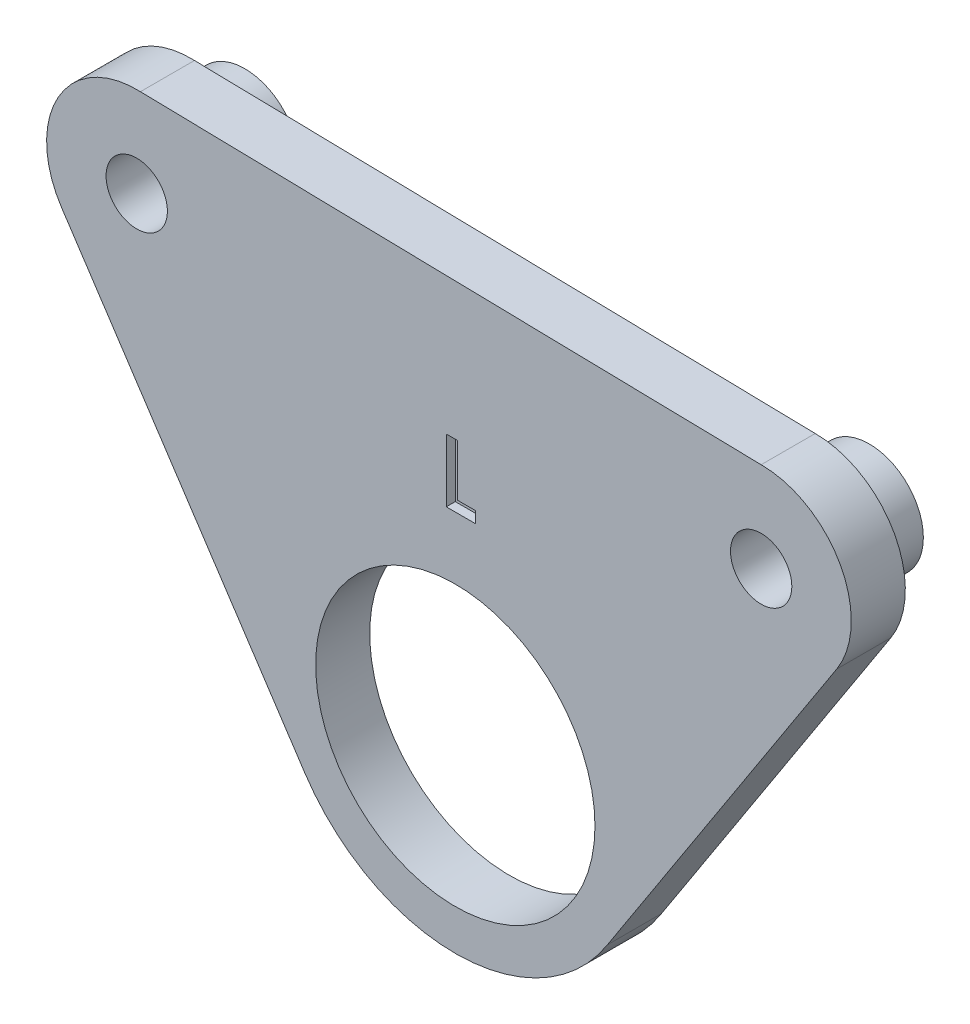
ISO-10303-21;
HEADER;
FILE_DESCRIPTION(('STEP AP214'),'2;1');
FILE_NAME('part.step','',(''),(''),'','','');
FILE_SCHEMA(('AUTOMOTIVE_DESIGN { 1 0 10303 214 1 1 1 1 }'));
ENDSEC;
DATA;
#1=APPLICATION_CONTEXT('core data for automotive mechanical design processes');
#2=APPLICATION_PROTOCOL_DEFINITION('international standard','automotive_design',2000,#1);
#3=PRODUCT_CONTEXT('',#1,'mechanical');
#4=PRODUCT('Part','Part','',(#3));
#5=PRODUCT_RELATED_PRODUCT_CATEGORY('part','',(#4));
#6=PRODUCT_DEFINITION_FORMATION('','',#4);
#7=PRODUCT_DEFINITION_CONTEXT('part definition',#1,'design');
#8=PRODUCT_DEFINITION('design','',#6,#7);
#9=PRODUCT_DEFINITION_SHAPE('','',#8);
#10=(LENGTH_UNIT() NAMED_UNIT(*) SI_UNIT(.MILLI.,.METRE.));
#11=(NAMED_UNIT(*) PLANE_ANGLE_UNIT() SI_UNIT($,.RADIAN.));
#12=(NAMED_UNIT(*) SI_UNIT($,.STERADIAN.) SOLID_ANGLE_UNIT());
#13=UNCERTAINTY_MEASURE_WITH_UNIT(LENGTH_MEASURE(1.E-05),#10,'distance_accuracy_value','');
#14=(GEOMETRIC_REPRESENTATION_CONTEXT(3) GLOBAL_UNCERTAINTY_ASSIGNED_CONTEXT((#13)) GLOBAL_UNIT_ASSIGNED_CONTEXT((#10,
#11,#12)) REPRESENTATION_CONTEXT('',''));
#15=CARTESIAN_POINT('',(0.,0.,0.));
#16=DIRECTION('',(0.,0.,1.));
#17=DIRECTION('',(1.,0.,0.));
#18=AXIS2_PLACEMENT_3D('',#15,#16,#17);
#19=CARTESIAN_POINT('',(0.,0.,3.));
#20=DIRECTION('',(0.,0.,1.));
#21=DIRECTION('',(1.,0.,0.));
#22=AXIS2_PLACEMENT_3D('',#19,#20,#21);
#23=PLANE('',#22);
#24=CARTESIAN_POINT('',(0.,0.,3.));
#25=DIRECTION('',(0.,0.,1.));
#26=DIRECTION('',(1.,0.,0.));
#27=AXIS2_PLACEMENT_3D('',#24,#25,#26);
#28=CIRCLE('',#27,7.75);
#29=CARTESIAN_POINT('',(7.75,0.,3.));
#30=VERTEX_POINT('',#29);
#31=EDGE_CURVE('E166',#30,#30,#28,.T.);
#32=ORIENTED_EDGE('',*,*,#31,.F.);
#33=EDGE_LOOP('',(#32));
#34=FACE_BOUND('',#33,.T.);
#35=DIRECTION('',(0.544290350783023,0.838896903108179,0.));
#36=VECTOR('',#35,1.);
#37=CARTESIAN_POINT('',(8.38866617449037,-5.44270700940501,3.));
#38=LINE('',#37,#36);
#39=CARTESIAN_POINT('',(8.4349155563697,-5.37142435085076,3.));
#40=VERTEX_POINT('',#39);
#41=CARTESIAN_POINT('',(21.165047264018,14.249110994562,3.));
#42=VERTEX_POINT('',#41);
#43=EDGE_CURVE('E184',#40,#42,#38,.T.);
#44=ORIENTED_EDGE('',*,*,#43,.T.);
#45=CARTESIAN_POINT('',(16.9705627484771,16.9705627484772,3.));
#46=DIRECTION('',(0.,0.,1.));
#47=DIRECTION('',(1.,0.,0.));
#48=AXIS2_PLACEMENT_3D('',#45,#46,#47);
#49=CIRCLE('',#48,5.00000000000006);
#50=CARTESIAN_POINT('',(16.9705627484771,21.9705627484772,3.));
#51=VERTEX_POINT('',#50);
#52=EDGE_CURVE('E101',#42,#51,#49,.T.);
#53=ORIENTED_EDGE('',*,*,#52,.T.);
#54=DIRECTION('',(0.999791818463447,-0.0204039146625116,0.));
#55=VECTOR('',#54,1.);
#56=CARTESIAN_POINT('',(0.455257342807428,22.3076097975724,3.));
#57=LINE('',#56,#55);
#58=CARTESIAN_POINT('',(-17.4736728602218,22.673506332328,3.));
#59=VERTEX_POINT('',#58);
#60=EDGE_CURVE('E119',#59,#51,#57,.T.);
#61=ORIENTED_EDGE('',*,*,#60,.F.);
#62=CARTESIAN_POINT('',(-17.6776695296638,17.6776695296636,3.));
#63=DIRECTION('',(0.,0.,1.));
#64=DIRECTION('',(1.,0.,0.));
#65=AXIS2_PLACEMENT_3D('',#62,#63,#64);
#66=CIRCLE('',#65,4.99999999999995);
#67=CARTESIAN_POINT('',(-21.8488779259881,14.9206746957124,3.));
#68=VERTEX_POINT('',#67);
#69=EDGE_CURVE('E112',#59,#68,#66,.T.);
#70=ORIENTED_EDGE('',*,*,#69,.T.);
#71=DIRECTION('',(0.551398966790246,-0.834241679264857,0.));
#72=VECTOR('',#71,1.);
#73=CARTESIAN_POINT('',(-8.34241679264857,-5.51398966790246,3.));
#74=LINE('',#73,#72);
#75=CARTESIAN_POINT('',(-8.34241679264857,-5.51398966790246,3.));
#76=VERTEX_POINT('',#75);
#77=EDGE_CURVE('E116',#68,#76,#74,.T.);
#78=ORIENTED_EDGE('',*,*,#77,.T.);
#79=CARTESIAN_POINT('',(0.,0.,3.));
#80=DIRECTION('',(0.,0.,1.));
#81=DIRECTION('',(1.,0.,0.));
#82=AXIS2_PLACEMENT_3D('',#79,#80,#81);
#83=CIRCLE('',#82,10.);
#84=EDGE_CURVE('E66',#76,#40,#83,.T.);
#85=ORIENTED_EDGE('',*,*,#84,.T.);
#86=EDGE_LOOP('',(#44,#53,#61,#70,#78,#85));
#87=FACE_BOUND('',#86,.T.);
#88=CARTESIAN_POINT('',(-17.6776695296638,17.6776695296636,3.));
#89=DIRECTION('',(0.,0.,1.));
#90=DIRECTION('',(1.,0.,0.));
#91=AXIS2_PLACEMENT_3D('',#88,#89,#90);
#92=CIRCLE('',#91,1.7025);
#93=CARTESIAN_POINT('',(-15.9751695296638,17.6776695296636,3.));
#94=VERTEX_POINT('',#93);
#95=EDGE_CURVE('E203',#94,#94,#92,.T.);
#96=ORIENTED_EDGE('',*,*,#95,.F.);
#97=EDGE_LOOP('',(#96));
#98=FACE_BOUND('',#97,.T.);
#99=CARTESIAN_POINT('',(16.9705627484771,16.9705627484772,3.));
#100=DIRECTION('',(0.,0.,1.));
#101=DIRECTION('',(1.,0.,0.));
#102=AXIS2_PLACEMENT_3D('',#99,#100,#101);
#103=CIRCLE('',#102,1.7025);
#104=CARTESIAN_POINT('',(18.6730627484771,16.9705627484772,3.));
#105=VERTEX_POINT('',#104);
#106=EDGE_CURVE('E219',#105,#105,#103,.T.);
#107=ORIENTED_EDGE('',*,*,#106,.F.);
#108=EDGE_LOOP('',(#107));
#109=FACE_BOUND('',#108,.T.);
#110=DIRECTION('',(-1.,0.,0.));
#111=VECTOR('',#110,1.);
#112=CARTESIAN_POINT('',(1.11433669953368,11.2108490749523,3.));
#113=LINE('',#112,#111);
#114=CARTESIAN_POINT('',(1.11433669953368,11.2108490749523,3.));
#115=VERTEX_POINT('',#114);
#116=CARTESIAN_POINT('',(-0.501047915850938,11.2108490749523,3.));
#117=VERTEX_POINT('',#116);
#118=EDGE_CURVE('E249',#115,#117,#113,.T.);
#119=ORIENTED_EDGE('',*,*,#118,.T.);
#120=DIRECTION('',(0.,1.,0.));
#121=VECTOR('',#120,1.);
#122=CARTESIAN_POINT('',(-0.501047915850938,11.2108490749523,3.));
#123=LINE('',#122,#121);
#124=CARTESIAN_POINT('',(-0.501047915850938,14.7108490749523,3.));
#125=VERTEX_POINT('',#124);
#126=EDGE_CURVE('E57',#117,#125,#123,.T.);
#127=ORIENTED_EDGE('',*,*,#126,.T.);
#128=DIRECTION('',(1.,0.,0.));
#129=VECTOR('',#128,1.);
#130=CARTESIAN_POINT('',(-0.501047915850938,14.7108490749523,3.));
#131=LINE('',#130,#129);
#132=CARTESIAN_POINT('',(0.12715721235419,14.7108490749523,3.));
#133=VERTEX_POINT('',#132);
#134=EDGE_CURVE('E266',#125,#133,#131,.T.);
#135=ORIENTED_EDGE('',*,*,#134,.T.);
#136=DIRECTION('',(0.,-1.,0.));
#137=VECTOR('',#136,1.);
#138=CARTESIAN_POINT('',(0.12715721235419,14.7108490749523,3.));
#139=LINE('',#138,#137);
#140=CARTESIAN_POINT('',(0.12715721235419,11.8390542031574,3.));
#141=VERTEX_POINT('',#140);
#142=EDGE_CURVE('E262',#133,#141,#139,.T.);
#143=ORIENTED_EDGE('',*,*,#142,.T.);
#144=DIRECTION('',(1.,0.,0.));
#145=VECTOR('',#144,1.);
#146=CARTESIAN_POINT('',(0.12715721235419,11.8390542031574,3.));
#147=LINE('',#146,#145);
#148=CARTESIAN_POINT('',(1.11433669953368,11.8390542031574,3.));
#149=VERTEX_POINT('',#148);
#150=EDGE_CURVE('E258',#141,#149,#147,.T.);
#151=ORIENTED_EDGE('',*,*,#150,.T.);
#152=DIRECTION('',(0.,-1.,0.));
#153=VECTOR('',#152,1.);
#154=CARTESIAN_POINT('',(1.11433669953368,11.8390542031574,3.));
#155=LINE('',#154,#153);
#156=EDGE_CURVE('E254',#149,#115,#155,.T.);
#157=ORIENTED_EDGE('',*,*,#156,.T.);
#158=EDGE_LOOP('',(#119,#127,#135,#143,#151,#157));
#159=FACE_BOUND('',#158,.T.);
#160=ADVANCED_FACE('F41',(#34,#87,#98,#109,#159),#23,.T.);
#161=CARTESIAN_POINT('',(8.38866617449037,-5.44270700940501,3.));
#162=DIRECTION('',(-0.838896903108179,0.544290350783023,0.));
#163=DIRECTION('',(-0.544290350783023,-0.838896903108179,0.));
#164=AXIS2_PLACEMENT_3D('',#161,#162,#163);
#165=PLANE('',#164);
#166=DIRECTION('',(0.544290350783023,0.838896903108179,0.));
#167=VECTOR('',#166,1.);
#168=CARTESIAN_POINT('',(8.38866617449037,-5.44270700940501,0.));
#169=LINE('',#168,#167);
#170=CARTESIAN_POINT('',(8.4349155563697,-5.37142435085076,0.));
#171=VERTEX_POINT('',#170);
#172=CARTESIAN_POINT('',(21.165047264018,14.249110994562,0.));
#173=VERTEX_POINT('',#172);
#174=EDGE_CURVE('E146',#171,#173,#169,.T.);
#175=ORIENTED_EDGE('',*,*,#174,.T.);
#176=DIRECTION('',(0.,0.,-1.));
#177=VECTOR('',#176,1.);
#178=CARTESIAN_POINT('',(21.165047264018,14.249110994562,3.));
#179=LINE('',#178,#177);
#180=EDGE_CURVE('E11',#42,#173,#179,.T.);
#181=ORIENTED_EDGE('',*,*,#180,.F.);
#182=ORIENTED_EDGE('',*,*,#43,.F.);
#183=DIRECTION('',(0.,0.,-1.));
#184=VECTOR('',#183,1.);
#185=CARTESIAN_POINT('',(8.4349155563697,-5.37142435085076,3.));
#186=LINE('',#185,#184);
#187=EDGE_CURVE('E138',#40,#171,#186,.T.);
#188=ORIENTED_EDGE('',*,*,#187,.T.);
#189=EDGE_LOOP('',(#175,#181,#182,#188));
#190=FACE_BOUND('',#189,.T.);
#191=ADVANCED_FACE('F185',(#190),#165,.F.);
#192=CARTESIAN_POINT('',(16.9705627484771,16.9705627484772,3.));
#193=DIRECTION('',(0.,0.,-1.));
#194=DIRECTION('',(-1.,0.,0.));
#195=AXIS2_PLACEMENT_3D('',#192,#193,#194);
#196=CYLINDRICAL_SURFACE('',#195,5.00000000000006);
#197=CARTESIAN_POINT('',(16.9705627484771,16.9705627484772,0.));
#198=DIRECTION('',(0.,0.,1.));
#199=DIRECTION('',(1.,0.,0.));
#200=AXIS2_PLACEMENT_3D('',#197,#198,#199);
#201=CIRCLE('',#200,5.00000000000006);
#202=CARTESIAN_POINT('',(16.9705627484771,21.9705627484772,0.));
#203=VERTEX_POINT('',#202);
#204=EDGE_CURVE('E151',#173,#203,#201,.T.);
#205=ORIENTED_EDGE('',*,*,#204,.T.);
#206=DIRECTION('',(0.,0.,-1.));
#207=VECTOR('',#206,1.);
#208=CARTESIAN_POINT('',(16.9705627484771,21.9705627484772,3.));
#209=LINE('',#208,#207);
#210=EDGE_CURVE('E50',#51,#203,#209,.T.);
#211=ORIENTED_EDGE('',*,*,#210,.F.);
#212=ORIENTED_EDGE('',*,*,#52,.F.);
#213=ORIENTED_EDGE('',*,*,#180,.T.);
#214=EDGE_LOOP('',(#205,#211,#212,#213));
#215=FACE_BOUND('',#214,.T.);
#216=ADVANCED_FACE('F176',(#215),#196,.T.);
#217=CARTESIAN_POINT('',(0.455257342807428,22.3076097975724,3.));
#218=DIRECTION('',(0.0204039146625116,0.999791818463446,0.));
#219=DIRECTION('',(-0.999791818463446,0.0204039146625116,0.));
#220=AXIS2_PLACEMENT_3D('',#217,#218,#219);
#221=PLANE('',#220);
#222=DIRECTION('',(0.999791818463447,-0.0204039146625116,0.));
#223=VECTOR('',#222,1.);
#224=CARTESIAN_POINT('',(0.455257342807428,22.3076097975724,0.));
#225=LINE('',#224,#223);
#226=CARTESIAN_POINT('',(-17.4736728602218,22.673506332328,0.));
#227=VERTEX_POINT('',#226);
#228=EDGE_CURVE('E155',#227,#203,#225,.T.);
#229=ORIENTED_EDGE('',*,*,#228,.F.);
#230=DIRECTION('',(0.,0.,-1.));
#231=VECTOR('',#230,1.);
#232=CARTESIAN_POINT('',(-17.4736728602218,22.673506332328,3.));
#233=LINE('',#232,#231);
#234=EDGE_CURVE('E131',#59,#227,#233,.T.);
#235=ORIENTED_EDGE('',*,*,#234,.F.);
#236=ORIENTED_EDGE('',*,*,#60,.T.);
#237=ORIENTED_EDGE('',*,*,#210,.T.);
#238=EDGE_LOOP('',(#229,#235,#236,#237));
#239=FACE_BOUND('',#238,.T.);
#240=ADVANCED_FACE('F175',(#239),#221,.T.);
#241=CARTESIAN_POINT('',(-17.6776695296638,17.6776695296636,3.));
#242=DIRECTION('',(0.,0.,-1.));
#243=DIRECTION('',(-1.,0.,0.));
#244=AXIS2_PLACEMENT_3D('',#241,#242,#243);
#245=CYLINDRICAL_SURFACE('',#244,4.99999999999995);
#246=CARTESIAN_POINT('',(-17.6776695296638,17.6776695296636,0.));
#247=DIRECTION('',(0.,0.,1.));
#248=DIRECTION('',(1.,0.,0.));
#249=AXIS2_PLACEMENT_3D('',#246,#247,#248);
#250=CIRCLE('',#249,4.99999999999995);
#251=CARTESIAN_POINT('',(-21.8488779259881,14.9206746957124,0.));
#252=VERTEX_POINT('',#251);
#253=EDGE_CURVE('E127',#227,#252,#250,.T.);
#254=ORIENTED_EDGE('',*,*,#253,.T.);
#255=DIRECTION('',(0.,0.,-1.));
#256=VECTOR('',#255,1.);
#257=CARTESIAN_POINT('',(-21.8488779259881,14.9206746957124,3.));
#258=LINE('',#257,#256);
#259=EDGE_CURVE('E124',#68,#252,#258,.T.);
#260=ORIENTED_EDGE('',*,*,#259,.F.);
#261=ORIENTED_EDGE('',*,*,#69,.F.);
#262=ORIENTED_EDGE('',*,*,#234,.T.);
#263=EDGE_LOOP('',(#254,#260,#261,#262));
#264=FACE_BOUND('',#263,.T.);
#265=ADVANCED_FACE('F125',(#264),#245,.T.);
#266=CARTESIAN_POINT('',(-8.34241679264857,-5.51398966790246,3.));
#267=DIRECTION('',(0.834241679264857,0.551398966790246,0.));
#268=DIRECTION('',(-0.551398966790246,0.834241679264857,0.));
#269=AXIS2_PLACEMENT_3D('',#266,#267,#268);
#270=PLANE('',#269);
#271=DIRECTION('',(0.551398966790246,-0.834241679264857,0.));
#272=VECTOR('',#271,1.);
#273=CARTESIAN_POINT('',(-8.34241679264857,-5.51398966790246,0.));
#274=LINE('',#273,#272);
#275=CARTESIAN_POINT('',(-8.34241679264857,-5.51398966790246,0.));
#276=VERTEX_POINT('',#275);
#277=EDGE_CURVE('E161',#252,#276,#274,.T.);
#278=ORIENTED_EDGE('',*,*,#277,.T.);
#279=DIRECTION('',(0.,0.,-1.));
#280=VECTOR('',#279,1.);
#281=CARTESIAN_POINT('',(-8.34241679264857,-5.51398966790246,3.));
#282=LINE('',#281,#280);
#283=EDGE_CURVE('E132',#76,#276,#282,.T.);
#284=ORIENTED_EDGE('',*,*,#283,.F.);
#285=ORIENTED_EDGE('',*,*,#77,.F.);
#286=ORIENTED_EDGE('',*,*,#259,.T.);
#287=EDGE_LOOP('',(#278,#284,#285,#286));
#288=FACE_BOUND('',#287,.T.);
#289=ADVANCED_FACE('F134',(#288),#270,.F.);
#290=CARTESIAN_POINT('',(0.,0.,3.));
#291=DIRECTION('',(0.,0.,-1.));
#292=DIRECTION('',(-1.,0.,0.));
#293=AXIS2_PLACEMENT_3D('',#290,#291,#292);
#294=CYLINDRICAL_SURFACE('',#293,7.75);
#295=ORIENTED_EDGE('',*,*,#31,.T.);
#296=EDGE_LOOP('',(#295));
#297=FACE_BOUND('',#296,.T.);
#298=CARTESIAN_POINT('',(0.,0.,0.));
#299=DIRECTION('',(0.,0.,1.));
#300=DIRECTION('',(1.,0.,0.));
#301=AXIS2_PLACEMENT_3D('',#298,#299,#300);
#302=CIRCLE('',#301,7.75);
#303=CARTESIAN_POINT('',(7.75,0.,0.));
#304=VERTEX_POINT('',#303);
#305=EDGE_CURVE('E142',#304,#304,#302,.T.);
#306=ORIENTED_EDGE('',*,*,#305,.F.);
#307=EDGE_LOOP('',(#306));
#308=FACE_BOUND('',#307,.T.);
#309=ADVANCED_FACE('F43',(#297,#308),#294,.F.);
#310=CARTESIAN_POINT('',(0.,0.,3.));
#311=DIRECTION('',(0.,0.,-1.));
#312=DIRECTION('',(-1.,0.,0.));
#313=AXIS2_PLACEMENT_3D('',#310,#311,#312);
#314=CYLINDRICAL_SURFACE('',#313,10.);
#315=CARTESIAN_POINT('',(0.,0.,0.));
#316=DIRECTION('',(0.,0.,1.));
#317=DIRECTION('',(1.,0.,0.));
#318=AXIS2_PLACEMENT_3D('',#315,#316,#317);
#319=CIRCLE('',#318,10.);
#320=EDGE_CURVE('E93',#276,#171,#319,.T.);
#321=ORIENTED_EDGE('',*,*,#320,.T.);
#322=ORIENTED_EDGE('',*,*,#187,.F.);
#323=ORIENTED_EDGE('',*,*,#84,.F.);
#324=ORIENTED_EDGE('',*,*,#283,.T.);
#325=EDGE_LOOP('',(#321,#322,#323,#324));
#326=FACE_BOUND('',#325,.T.);
#327=ADVANCED_FACE('F181',(#326),#314,.T.);
#328=CARTESIAN_POINT('',(0.,0.,0.));
#329=DIRECTION('',(0.,0.,1.));
#330=DIRECTION('',(1.,0.,0.));
#331=AXIS2_PLACEMENT_3D('',#328,#329,#330);
#332=PLANE('',#331);
#333=ORIENTED_EDGE('',*,*,#305,.T.);
#334=EDGE_LOOP('',(#333));
#335=FACE_BOUND('',#334,.T.);
#336=CARTESIAN_POINT('',(-17.6776695296638,17.6776695296636,0.));
#337=DIRECTION('',(0.,0.,1.));
#338=DIRECTION('',(1.,0.,0.));
#339=AXIS2_PLACEMENT_3D('',#336,#337,#338);
#340=CIRCLE('',#339,3.00000000000012);
#341=CARTESIAN_POINT('',(-14.6776695296637,17.6776695296636,0.));
#342=VERTEX_POINT('',#341);
#343=EDGE_CURVE('E147',#342,#342,#340,.T.);
#344=ORIENTED_EDGE('',*,*,#343,.T.);
#345=EDGE_LOOP('',(#344));
#346=FACE_BOUND('',#345,.T.);
#347=CARTESIAN_POINT('',(16.9705627484771,16.9705627484772,0.));
#348=DIRECTION('',(0.,0.,1.));
#349=DIRECTION('',(1.,0.,0.));
#350=AXIS2_PLACEMENT_3D('',#347,#348,#349);
#351=CIRCLE('',#350,3.00000000000005);
#352=CARTESIAN_POINT('',(19.9705627484771,16.9705627484772,0.));
#353=VERTEX_POINT('',#352);
#354=EDGE_CURVE('E207',#353,#353,#351,.T.);
#355=ORIENTED_EDGE('',*,*,#354,.T.);
#356=EDGE_LOOP('',(#355));
#357=FACE_BOUND('',#356,.T.);
#358=ORIENTED_EDGE('',*,*,#174,.F.);
#359=ORIENTED_EDGE('',*,*,#320,.F.);
#360=ORIENTED_EDGE('',*,*,#277,.F.);
#361=ORIENTED_EDGE('',*,*,#253,.F.);
#362=ORIENTED_EDGE('',*,*,#228,.T.);
#363=ORIENTED_EDGE('',*,*,#204,.F.);
#364=EDGE_LOOP('',(#358,#359,#360,#361,#362,#363));
#365=FACE_BOUND('',#364,.T.);
#366=ADVANCED_FACE('F180',(#335,#346,#357,#365),#332,.F.);
#367=CARTESIAN_POINT('',(-17.6776695296638,17.6776695296636,-3.));
#368=DIRECTION('',(0.,0.,1.));
#369=DIRECTION('',(1.,0.,0.));
#370=AXIS2_PLACEMENT_3D('',#367,#368,#369);
#371=CYLINDRICAL_SURFACE('',#370,3.00000000000012);
#372=CARTESIAN_POINT('',(-17.6776695296638,17.6776695296636,-3.));
#373=DIRECTION('',(0.,0.,1.));
#374=DIRECTION('',(1.,0.,0.));
#375=AXIS2_PLACEMENT_3D('',#372,#373,#374);
#376=CIRCLE('',#375,3.00000000000012);
#377=CARTESIAN_POINT('',(-14.6776695296637,17.6776695296636,-3.));
#378=VERTEX_POINT('',#377);
#379=EDGE_CURVE('E198',#378,#378,#376,.T.);
#380=ORIENTED_EDGE('',*,*,#379,.T.);
#381=EDGE_LOOP('',(#380));
#382=FACE_BOUND('',#381,.T.);
#383=ORIENTED_EDGE('',*,*,#343,.F.);
#384=EDGE_LOOP('',(#383));
#385=FACE_BOUND('',#384,.T.);
#386=ADVANCED_FACE('F358',(#382,#385),#371,.T.);
#387=CARTESIAN_POINT('',(-17.6776695296638,17.6776695296636,-3.));
#388=DIRECTION('',(0.,0.,1.));
#389=DIRECTION('',(1.,0.,0.));
#390=AXIS2_PLACEMENT_3D('',#387,#388,#389);
#391=PLANE('',#390);
#392=CARTESIAN_POINT('',(-17.6776695296638,17.6776695296636,-3.));
#393=DIRECTION('',(0.,0.,1.));
#394=DIRECTION('',(1.,0.,0.));
#395=AXIS2_PLACEMENT_3D('',#392,#393,#394);
#396=CIRCLE('',#395,1.7025);
#397=CARTESIAN_POINT('',(-15.9751695296638,17.6776695296636,-3.));
#398=VERTEX_POINT('',#397);
#399=EDGE_CURVE('E202',#398,#398,#396,.T.);
#400=ORIENTED_EDGE('',*,*,#399,.T.);
#401=EDGE_LOOP('',(#400));
#402=FACE_BOUND('',#401,.T.);
#403=ORIENTED_EDGE('',*,*,#379,.F.);
#404=EDGE_LOOP('',(#403));
#405=FACE_BOUND('',#404,.T.);
#406=ADVANCED_FACE('F408',(#402,#405),#391,.F.);
#407=CARTESIAN_POINT('',(-17.6776695296638,17.6776695296636,-3.));
#408=DIRECTION('',(0.,0.,1.));
#409=DIRECTION('',(1.,0.,0.));
#410=AXIS2_PLACEMENT_3D('',#407,#408,#409);
#411=CYLINDRICAL_SURFACE('',#410,1.7025);
#412=ORIENTED_EDGE('',*,*,#399,.F.);
#413=EDGE_LOOP('',(#412));
#414=FACE_BOUND('',#413,.T.);
#415=ORIENTED_EDGE('',*,*,#95,.T.);
#416=EDGE_LOOP('',(#415));
#417=FACE_BOUND('',#416,.T.);
#418=ADVANCED_FACE('F415',(#414,#417),#411,.F.);
#419=CARTESIAN_POINT('',(16.9705627484771,16.9705627484772,-3.));
#420=DIRECTION('',(0.,0.,1.));
#421=DIRECTION('',(1.,0.,0.));
#422=AXIS2_PLACEMENT_3D('',#419,#420,#421);
#423=CYLINDRICAL_SURFACE('',#422,3.00000000000005);
#424=CARTESIAN_POINT('',(16.9705627484771,16.9705627484772,-3.));
#425=DIRECTION('',(0.,0.,1.));
#426=DIRECTION('',(1.,0.,0.));
#427=AXIS2_PLACEMENT_3D('',#424,#425,#426);
#428=CIRCLE('',#427,3.00000000000005);
#429=CARTESIAN_POINT('',(19.9705627484771,16.9705627484772,-3.));
#430=VERTEX_POINT('',#429);
#431=EDGE_CURVE('E214',#430,#430,#428,.T.);
#432=ORIENTED_EDGE('',*,*,#431,.T.);
#433=EDGE_LOOP('',(#432));
#434=FACE_BOUND('',#433,.T.);
#435=ORIENTED_EDGE('',*,*,#354,.F.);
#436=EDGE_LOOP('',(#435));
#437=FACE_BOUND('',#436,.T.);
#438=ADVANCED_FACE('F422',(#434,#437),#423,.T.);
#439=CARTESIAN_POINT('',(16.9705627484771,16.9705627484772,-3.));
#440=DIRECTION('',(0.,0.,1.));
#441=DIRECTION('',(1.,0.,0.));
#442=AXIS2_PLACEMENT_3D('',#439,#440,#441);
#443=PLANE('',#442);
#444=CARTESIAN_POINT('',(16.9705627484771,16.9705627484772,-3.));
#445=DIRECTION('',(0.,0.,1.));
#446=DIRECTION('',(1.,0.,0.));
#447=AXIS2_PLACEMENT_3D('',#444,#445,#446);
#448=CIRCLE('',#447,1.7025);
#449=CARTESIAN_POINT('',(18.6730627484771,16.9705627484772,-3.));
#450=VERTEX_POINT('',#449);
#451=EDGE_CURVE('E218',#450,#450,#448,.T.);
#452=ORIENTED_EDGE('',*,*,#451,.T.);
#453=EDGE_LOOP('',(#452));
#454=FACE_BOUND('',#453,.T.);
#455=ORIENTED_EDGE('',*,*,#431,.F.);
#456=EDGE_LOOP('',(#455));
#457=FACE_BOUND('',#456,.T.);
#458=ADVANCED_FACE('F430',(#454,#457),#443,.F.);
#459=CARTESIAN_POINT('',(16.9705627484771,16.9705627484772,-3.));
#460=DIRECTION('',(0.,0.,1.));
#461=DIRECTION('',(1.,0.,0.));
#462=AXIS2_PLACEMENT_3D('',#459,#460,#461);
#463=CYLINDRICAL_SURFACE('',#462,1.7025);
#464=ORIENTED_EDGE('',*,*,#451,.F.);
#465=EDGE_LOOP('',(#464));
#466=FACE_BOUND('',#465,.T.);
#467=ORIENTED_EDGE('',*,*,#106,.T.);
#468=EDGE_LOOP('',(#467));
#469=FACE_BOUND('',#468,.T.);
#470=ADVANCED_FACE('F438',(#466,#469),#463,.F.);
#471=CARTESIAN_POINT('',(-0.501047915850938,11.2108490749523,2.5));
#472=DIRECTION('',(1.,0.,0.));
#473=DIRECTION('',(0.,0.,-1.));
#474=AXIS2_PLACEMENT_3D('',#471,#472,#473);
#475=PLANE('',#474);
#476=ORIENTED_EDGE('',*,*,#126,.F.);
#477=DIRECTION('',(0.,0.,1.));
#478=VECTOR('',#477,1.);
#479=CARTESIAN_POINT('',(-0.501047915850938,11.2108490749523,2.5));
#480=LINE('',#479,#478);
#481=CARTESIAN_POINT('',(-0.501047915850938,11.2108490749523,2.5));
#482=VERTEX_POINT('',#481);
#483=EDGE_CURVE('E245',#482,#117,#480,.T.);
#484=ORIENTED_EDGE('',*,*,#483,.F.);
#485=DIRECTION('',(0.,1.,0.));
#486=VECTOR('',#485,1.);
#487=CARTESIAN_POINT('',(-0.501047915850938,11.2108490749523,2.5));
#488=LINE('',#487,#486);
#489=CARTESIAN_POINT('',(-0.501047915850938,14.7108490749523,2.5));
#490=VERTEX_POINT('',#489);
#491=EDGE_CURVE('E253',#482,#490,#488,.T.);
#492=ORIENTED_EDGE('',*,*,#491,.T.);
#493=DIRECTION('',(0.,0.,1.));
#494=VECTOR('',#493,1.);
#495=CARTESIAN_POINT('',(-0.501047915850938,14.7108490749523,2.5));
#496=LINE('',#495,#494);
#497=EDGE_CURVE('E223',#490,#125,#496,.T.);
#498=ORIENTED_EDGE('',*,*,#497,.T.);
#499=EDGE_LOOP('',(#476,#484,#492,#498));
#500=FACE_BOUND('',#499,.T.);
#501=ADVANCED_FACE('F296',(#500),#475,.T.);
#502=CARTESIAN_POINT('',(-0.501047915850938,14.7108490749523,2.5));
#503=DIRECTION('',(0.,-1.,0.));
#504=DIRECTION('',(0.,0.,-1.));
#505=AXIS2_PLACEMENT_3D('',#502,#503,#504);
#506=PLANE('',#505);
#507=ORIENTED_EDGE('',*,*,#134,.F.);
#508=ORIENTED_EDGE('',*,*,#497,.F.);
#509=DIRECTION('',(1.,0.,0.));
#510=VECTOR('',#509,1.);
#511=CARTESIAN_POINT('',(-0.501047915850938,14.7108490749523,2.5));
#512=LINE('',#511,#510);
#513=CARTESIAN_POINT('',(0.12715721235419,14.7108490749523,2.5));
#514=VERTEX_POINT('',#513);
#515=EDGE_CURVE('E287',#490,#514,#512,.T.);
#516=ORIENTED_EDGE('',*,*,#515,.T.);
#517=DIRECTION('',(0.,0.,1.));
#518=VECTOR('',#517,1.);
#519=CARTESIAN_POINT('',(0.12715721235419,14.7108490749523,2.5));
#520=LINE('',#519,#518);
#521=EDGE_CURVE('E229',#514,#133,#520,.T.);
#522=ORIENTED_EDGE('',*,*,#521,.T.);
#523=EDGE_LOOP('',(#507,#508,#516,#522));
#524=FACE_BOUND('',#523,.T.);
#525=ADVANCED_FACE('F305',(#524),#506,.T.);
#526=CARTESIAN_POINT('',(0.12715721235419,14.7108490749523,2.5));
#527=DIRECTION('',(-1.,0.,0.));
#528=DIRECTION('',(0.,0.,1.));
#529=AXIS2_PLACEMENT_3D('',#526,#527,#528);
#530=PLANE('',#529);
#531=ORIENTED_EDGE('',*,*,#142,.F.);
#532=ORIENTED_EDGE('',*,*,#521,.F.);
#533=DIRECTION('',(0.,-1.,0.));
#534=VECTOR('',#533,1.);
#535=CARTESIAN_POINT('',(0.12715721235419,14.7108490749523,2.5));
#536=LINE('',#535,#534);
#537=CARTESIAN_POINT('',(0.12715721235419,11.8390542031574,2.5));
#538=VERTEX_POINT('',#537);
#539=EDGE_CURVE('E283',#514,#538,#536,.T.);
#540=ORIENTED_EDGE('',*,*,#539,.T.);
#541=DIRECTION('',(0.,0.,1.));
#542=VECTOR('',#541,1.);
#543=CARTESIAN_POINT('',(0.12715721235419,11.8390542031574,2.5));
#544=LINE('',#543,#542);
#545=EDGE_CURVE('E233',#538,#141,#544,.T.);
#546=ORIENTED_EDGE('',*,*,#545,.T.);
#547=EDGE_LOOP('',(#531,#532,#540,#546));
#548=FACE_BOUND('',#547,.T.);
#549=ADVANCED_FACE('F340',(#548),#530,.T.);
#550=CARTESIAN_POINT('',(0.12715721235419,11.8390542031574,2.5));
#551=DIRECTION('',(0.,-1.,0.));
#552=DIRECTION('',(0.,0.,-1.));
#553=AXIS2_PLACEMENT_3D('',#550,#551,#552);
#554=PLANE('',#553);
#555=ORIENTED_EDGE('',*,*,#150,.F.);
#556=ORIENTED_EDGE('',*,*,#545,.F.);
#557=DIRECTION('',(1.,0.,0.));
#558=VECTOR('',#557,1.);
#559=CARTESIAN_POINT('',(0.12715721235419,11.8390542031574,2.5));
#560=LINE('',#559,#558);
#561=CARTESIAN_POINT('',(1.11433669953368,11.8390542031574,2.5));
#562=VERTEX_POINT('',#561);
#563=EDGE_CURVE('E279',#538,#562,#560,.T.);
#564=ORIENTED_EDGE('',*,*,#563,.T.);
#565=DIRECTION('',(0.,0.,1.));
#566=VECTOR('',#565,1.);
#567=CARTESIAN_POINT('',(1.11433669953368,11.8390542031574,2.5));
#568=LINE('',#567,#566);
#569=EDGE_CURVE('E237',#562,#149,#568,.T.);
#570=ORIENTED_EDGE('',*,*,#569,.T.);
#571=EDGE_LOOP('',(#555,#556,#564,#570));
#572=FACE_BOUND('',#571,.T.);
#573=ADVANCED_FACE('F329',(#572),#554,.T.);
#574=CARTESIAN_POINT('',(1.11433669953368,11.8390542031574,2.5));
#575=DIRECTION('',(-1.,0.,0.));
#576=DIRECTION('',(0.,0.,1.));
#577=AXIS2_PLACEMENT_3D('',#574,#575,#576);
#578=PLANE('',#577);
#579=ORIENTED_EDGE('',*,*,#156,.F.);
#580=ORIENTED_EDGE('',*,*,#569,.F.);
#581=DIRECTION('',(0.,-1.,0.));
#582=VECTOR('',#581,1.);
#583=CARTESIAN_POINT('',(1.11433669953368,11.8390542031574,2.5));
#584=LINE('',#583,#582);
#585=CARTESIAN_POINT('',(1.11433669953368,11.2108490749523,2.5));
#586=VERTEX_POINT('',#585);
#587=EDGE_CURVE('E275',#562,#586,#584,.T.);
#588=ORIENTED_EDGE('',*,*,#587,.T.);
#589=DIRECTION('',(0.,0.,1.));
#590=VECTOR('',#589,1.);
#591=CARTESIAN_POINT('',(1.11433669953368,11.2108490749523,2.5));
#592=LINE('',#591,#590);
#593=EDGE_CURVE('E241',#586,#115,#592,.T.);
#594=ORIENTED_EDGE('',*,*,#593,.T.);
#595=EDGE_LOOP('',(#579,#580,#588,#594));
#596=FACE_BOUND('',#595,.T.);
#597=ADVANCED_FACE('F323',(#596),#578,.T.);
#598=CARTESIAN_POINT('',(1.11433669953368,11.2108490749523,2.5));
#599=DIRECTION('',(0.,1.,0.));
#600=DIRECTION('',(0.,0.,1.));
#601=AXIS2_PLACEMENT_3D('',#598,#599,#600);
#602=PLANE('',#601);
#603=ORIENTED_EDGE('',*,*,#118,.F.);
#604=ORIENTED_EDGE('',*,*,#593,.F.);
#605=DIRECTION('',(-1.,0.,0.));
#606=VECTOR('',#605,1.);
#607=CARTESIAN_POINT('',(1.11433669953368,11.2108490749523,2.5));
#608=LINE('',#607,#606);
#609=EDGE_CURVE('E248',#586,#482,#608,.T.);
#610=ORIENTED_EDGE('',*,*,#609,.T.);
#611=ORIENTED_EDGE('',*,*,#483,.T.);
#612=EDGE_LOOP('',(#603,#604,#610,#611));
#613=FACE_BOUND('',#612,.T.);
#614=ADVANCED_FACE('F327',(#613),#602,.T.);
#615=CARTESIAN_POINT('',(0.,0.,2.5));
#616=DIRECTION('',(0.,0.,-1.));
#617=DIRECTION('',(-1.,0.,0.));
#618=AXIS2_PLACEMENT_3D('',#615,#616,#617);
#619=PLANE('',#618);
#620=ORIENTED_EDGE('',*,*,#491,.F.);
#621=ORIENTED_EDGE('',*,*,#609,.F.);
#622=ORIENTED_EDGE('',*,*,#587,.F.);
#623=ORIENTED_EDGE('',*,*,#563,.F.);
#624=ORIENTED_EDGE('',*,*,#539,.F.);
#625=ORIENTED_EDGE('',*,*,#515,.F.);
#626=EDGE_LOOP('',(#620,#621,#622,#623,#624,#625));
#627=FACE_BOUND('',#626,.T.);
#628=ADVANCED_FACE('F336',(#627),#619,.F.);
#629=CLOSED_SHELL('',(#160,#191,#216,#240,#265,#289,#309,#327,#366,#386,#406,#418,#438,#458,
#470,#501,#525,#549,#573,#597,#614,#628));
#630=MANIFOLD_SOLID_BREP('B2',#629);
#631=ADVANCED_BREP_SHAPE_REPRESENTATION('',(#18,#630),#14);
#632=SHAPE_DEFINITION_REPRESENTATION(#9,#631);
ENDSEC;
END-ISO-10303-21;
